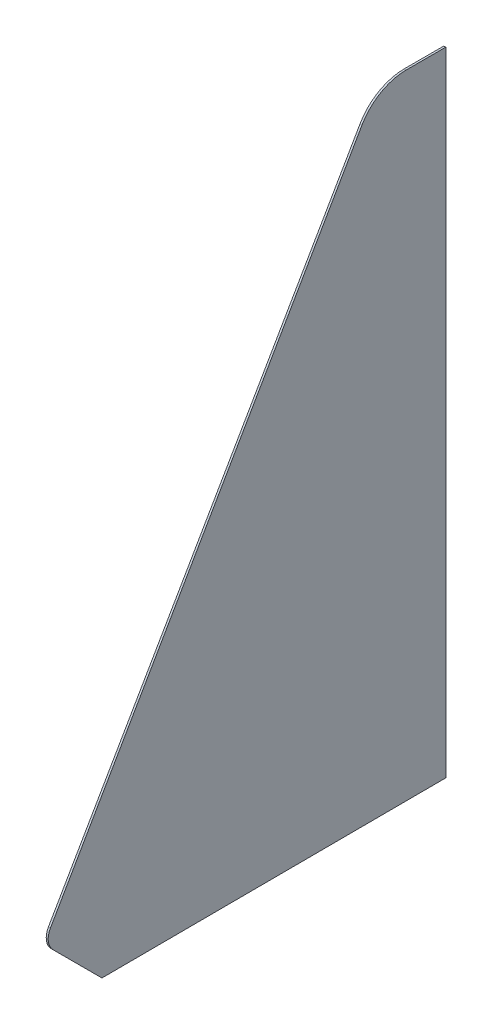
ISO-10303-21;
HEADER;
FILE_DESCRIPTION(('STEP AP214'),'2;1');
FILE_NAME('part.step','',(''),(''),'','','');
FILE_SCHEMA(('AUTOMOTIVE_DESIGN { 1 0 10303 214 1 1 1 1 }'));
ENDSEC;
DATA;
#1=APPLICATION_CONTEXT('core data for automotive mechanical design processes');
#2=APPLICATION_PROTOCOL_DEFINITION('international standard','automotive_design',2000,#1);
#3=PRODUCT_CONTEXT('',#1,'mechanical');
#4=PRODUCT('Part','Part','',(#3));
#5=PRODUCT_RELATED_PRODUCT_CATEGORY('part','',(#4));
#6=PRODUCT_DEFINITION_FORMATION('','',#4);
#7=PRODUCT_DEFINITION_CONTEXT('part definition',#1,'design');
#8=PRODUCT_DEFINITION('design','',#6,#7);
#9=PRODUCT_DEFINITION_SHAPE('','',#8);
#10=(LENGTH_UNIT() NAMED_UNIT(*) SI_UNIT(.MILLI.,.METRE.));
#11=(NAMED_UNIT(*) PLANE_ANGLE_UNIT() SI_UNIT($,.RADIAN.));
#12=(NAMED_UNIT(*) SI_UNIT($,.STERADIAN.) SOLID_ANGLE_UNIT());
#13=UNCERTAINTY_MEASURE_WITH_UNIT(LENGTH_MEASURE(1.E-05),#10,'distance_accuracy_value','');
#14=(GEOMETRIC_REPRESENTATION_CONTEXT(3) GLOBAL_UNCERTAINTY_ASSIGNED_CONTEXT((#13)) GLOBAL_UNIT_ASSIGNED_CONTEXT((#10,
#11,#12)) REPRESENTATION_CONTEXT('',''));
#15=CARTESIAN_POINT('',(0.,0.,0.));
#16=DIRECTION('',(0.,0.,1.));
#17=DIRECTION('',(1.,0.,0.));
#18=AXIS2_PLACEMENT_3D('',#15,#16,#17);
#19=CARTESIAN_POINT('',(0.,589.999999999999,39.9999999999981));
#20=DIRECTION('',(-1.,0.,0.));
#21=DIRECTION('',(0.,0.,1.));
#22=AXIS2_PLACEMENT_3D('',#19,#20,#21);
#23=CYLINDRICAL_SURFACE('',#22,52.0000000000009);
#24=DIRECTION('',(1.,0.,0.));
#25=VECTOR('',#24,1.);
#26=CARTESIAN_POINT('',(0.,641.999999999999,39.9999999999981));
#27=LINE('',#26,#25);
#28=CARTESIAN_POINT('',(0.,641.999999999999,39.9999999999981));
#29=VERTEX_POINT('',#28);
#30=CARTESIAN_POINT('',(2.,641.999999999999,39.9999999999981));
#31=VERTEX_POINT('',#30);
#32=EDGE_CURVE('E11',#29,#31,#27,.T.);
#33=ORIENTED_EDGE('',*,*,#32,.F.);
#34=CARTESIAN_POINT('',(0.,589.999999999999,39.9999999999981));
#35=DIRECTION('',(1.,0.,0.));
#36=DIRECTION('',(0.,0.,-1.));
#37=AXIS2_PLACEMENT_3D('',#34,#35,#36);
#38=CIRCLE('',#37,52.0000000000009);
#39=CARTESIAN_POINT('',(0.,615.999999999999,85.0333209967898));
#40=VERTEX_POINT('',#39);
#41=EDGE_CURVE('E152',#29,#40,#38,.T.);
#42=ORIENTED_EDGE('',*,*,#41,.T.);
#43=DIRECTION('',(1.,0.,0.));
#44=VECTOR('',#43,1.);
#45=CARTESIAN_POINT('',(0.,615.999999999999,85.0333209967898));
#46=LINE('',#45,#44);
#47=CARTESIAN_POINT('',(2.,615.999999999999,85.0333209967898));
#48=VERTEX_POINT('',#47);
#49=EDGE_CURVE('E60',#40,#48,#46,.T.);
#50=ORIENTED_EDGE('',*,*,#49,.T.);
#51=CARTESIAN_POINT('',(2.,589.999999999999,39.9999999999981));
#52=DIRECTION('',(1.,0.,0.));
#53=DIRECTION('',(0.,0.,-1.));
#54=AXIS2_PLACEMENT_3D('',#51,#52,#53);
#55=CIRCLE('',#54,52.0000000000009);
#56=EDGE_CURVE('E151',#31,#48,#55,.T.);
#57=ORIENTED_EDGE('',*,*,#56,.F.);
#58=EDGE_LOOP('',(#33,#42,#50,#57));
#59=FACE_BOUND('',#58,.T.);
#60=ADVANCED_FACE('F49',(#59),#23,.T.);
#61=CARTESIAN_POINT('',(0.,615.999999999999,85.0333209967898));
#62=DIRECTION('',(0.,-0.5,-0.866025403784439));
#63=DIRECTION('',(0.,-0.866025403784439,0.5));
#64=AXIS2_PLACEMENT_3D('',#61,#62,#63);
#65=PLANE('',#64);
#66=ORIENTED_EDGE('',*,*,#49,.F.);
#67=DIRECTION('',(0.,-0.866025403784439,0.5));
#68=VECTOR('',#67,1.);
#69=CARTESIAN_POINT('',(0.,615.999999999999,85.0333209967898));
#70=LINE('',#69,#68);
#71=CARTESIAN_POINT('',(0.,68.6719448082339,401.03332099679));
#72=VERTEX_POINT('',#71);
#73=EDGE_CURVE('E182',#40,#72,#70,.T.);
#74=ORIENTED_EDGE('',*,*,#73,.T.);
#75=DIRECTION('',(1.,0.,0.));
#76=VECTOR('',#75,1.);
#77=CARTESIAN_POINT('',(0.,68.6719448082339,401.03332099679));
#78=LINE('',#77,#76);
#79=CARTESIAN_POINT('',(2.,68.6719448082339,401.03332099679));
#80=VERTEX_POINT('',#79);
#81=EDGE_CURVE('E143',#72,#80,#78,.T.);
#82=ORIENTED_EDGE('',*,*,#81,.T.);
#83=DIRECTION('',(0.,-0.866025403784439,0.5));
#84=VECTOR('',#83,1.);
#85=CARTESIAN_POINT('',(2.,615.999999999999,85.0333209967898));
#86=LINE('',#85,#84);
#87=EDGE_CURVE('E162',#48,#80,#86,.T.);
#88=ORIENTED_EDGE('',*,*,#87,.F.);
#89=EDGE_LOOP('',(#66,#74,#82,#88));
#90=FACE_BOUND('',#89,.T.);
#91=ADVANCED_FACE('F167',(#90),#65,.F.);
#92=CARTESIAN_POINT('',(0.,60.1719448082339,386.310889132454));
#93=DIRECTION('',(-1.,0.,0.));
#94=DIRECTION('',(0.,0.,1.));
#95=AXIS2_PLACEMENT_3D('',#92,#93,#94);
#96=CYLINDRICAL_SURFACE('',#95,17.0000000000001);
#97=ORIENTED_EDGE('',*,*,#81,.F.);
#98=CARTESIAN_POINT('',(0.,60.1719448082339,386.310889132454));
#99=DIRECTION('',(1.,0.,0.));
#100=DIRECTION('',(0.,0.,1.));
#101=AXIS2_PLACEMENT_3D('',#98,#99,#100);
#102=CIRCLE('',#101,17.0000000000001);
#103=CARTESIAN_POINT('',(0.,48.1511295280625,398.331704412626));
#104=VERTEX_POINT('',#103);
#105=EDGE_CURVE('E134',#72,#104,#102,.T.);
#106=ORIENTED_EDGE('',*,*,#105,.T.);
#107=DIRECTION('',(1.,0.,0.));
#108=VECTOR('',#107,1.);
#109=CARTESIAN_POINT('',(0.,48.1511295280625,398.331704412626));
#110=LINE('',#109,#108);
#111=CARTESIAN_POINT('',(2.,48.1511295280625,398.331704412626));
#112=VERTEX_POINT('',#111);
#113=EDGE_CURVE('E140',#104,#112,#110,.T.);
#114=ORIENTED_EDGE('',*,*,#113,.T.);
#115=CARTESIAN_POINT('',(2.,60.1719448082339,386.310889132454));
#116=DIRECTION('',(1.,0.,0.));
#117=DIRECTION('',(0.,0.,-1.));
#118=AXIS2_PLACEMENT_3D('',#115,#116,#117);
#119=CIRCLE('',#118,17.0000000000001);
#120=EDGE_CURVE('E169',#80,#112,#119,.T.);
#121=ORIENTED_EDGE('',*,*,#120,.F.);
#122=EDGE_LOOP('',(#97,#106,#114,#121));
#123=FACE_BOUND('',#122,.T.);
#124=ADVANCED_FACE('F188',(#123),#96,.T.);
#125=CARTESIAN_POINT('',(0.,-1.41421356237309,348.76636132219));
#126=DIRECTION('',(0.,0.707106781186548,-0.707106781186547));
#127=DIRECTION('',(0.,-0.707106781186547,-0.707106781186548));
#128=AXIS2_PLACEMENT_3D('',#125,#126,#127);
#129=PLANE('',#128);
#130=ORIENTED_EDGE('',*,*,#113,.F.);
#131=DIRECTION('',(0.,-0.707106781186547,-0.707106781186548));
#132=VECTOR('',#131,1.);
#133=CARTESIAN_POINT('',(0.,-1.41421356237309,348.76636132219));
#134=LINE('',#133,#132);
#135=CARTESIAN_POINT('',(0.,-1.41421356237309,348.76636132219));
#136=VERTEX_POINT('',#135);
#137=EDGE_CURVE('E128',#104,#136,#134,.T.);
#138=ORIENTED_EDGE('',*,*,#137,.T.);
#139=DIRECTION('',(1.,0.,0.));
#140=VECTOR('',#139,1.);
#141=CARTESIAN_POINT('',(0.,-1.41421356237309,348.76636132219));
#142=LINE('',#141,#140);
#143=CARTESIAN_POINT('',(2.,-1.41421356237309,348.76636132219));
#144=VERTEX_POINT('',#143);
#145=EDGE_CURVE('E103',#136,#144,#142,.T.);
#146=ORIENTED_EDGE('',*,*,#145,.T.);
#147=DIRECTION('',(0.,-0.707106781186547,-0.707106781186548));
#148=VECTOR('',#147,1.);
#149=CARTESIAN_POINT('',(2.,-1.41421356237309,348.76636132219));
#150=LINE('',#149,#148);
#151=EDGE_CURVE('E172',#112,#144,#150,.T.);
#152=ORIENTED_EDGE('',*,*,#151,.F.);
#153=EDGE_LOOP('',(#130,#138,#146,#152));
#154=FACE_BOUND('',#153,.T.);
#155=ADVANCED_FACE('F190',(#154),#129,.F.);
#156=CARTESIAN_POINT('',(0.,0.,0.));
#157=DIRECTION('',(0.,0.999991778984563,0.00405486908410621));
#158=DIRECTION('',(0.,0.00405486908410621,-0.999991778984563));
#159=AXIS2_PLACEMENT_3D('',#156,#157,#158);
#160=PLANE('',#159);
#161=ORIENTED_EDGE('',*,*,#145,.F.);
#162=DIRECTION('',(0.,0.00405486908410621,-0.999991778984563));
#163=VECTOR('',#162,1.);
#164=CARTESIAN_POINT('',(0.,0.,0.));
#165=LINE('',#164,#163);
#166=CARTESIAN_POINT('',(0.,0.,0.));
#167=VERTEX_POINT('',#166);
#168=EDGE_CURVE('E120',#136,#167,#165,.T.);
#169=ORIENTED_EDGE('',*,*,#168,.T.);
#170=DIRECTION('',(1.,0.,0.));
#171=VECTOR('',#170,1.);
#172=CARTESIAN_POINT('',(0.,0.,0.));
#173=LINE('',#172,#171);
#174=CARTESIAN_POINT('',(2.,0.,0.));
#175=VERTEX_POINT('',#174);
#176=EDGE_CURVE('E68',#167,#175,#173,.T.);
#177=ORIENTED_EDGE('',*,*,#176,.T.);
#178=DIRECTION('',(0.,0.00405486908410621,-0.999991778984563));
#179=VECTOR('',#178,1.);
#180=CARTESIAN_POINT('',(2.,0.,0.));
#181=LINE('',#180,#179);
#182=EDGE_CURVE('E194',#144,#175,#181,.T.);
#183=ORIENTED_EDGE('',*,*,#182,.F.);
#184=EDGE_LOOP('',(#161,#169,#177,#183));
#185=FACE_BOUND('',#184,.T.);
#186=ADVANCED_FACE('F126',(#185),#160,.F.);
#187=CARTESIAN_POINT('',(0.,641.999999999999,0.));
#188=DIRECTION('',(0.,0.,1.));
#189=DIRECTION('',(0.,1.,0.));
#190=AXIS2_PLACEMENT_3D('',#187,#188,#189);
#191=PLANE('',#190);
#192=ORIENTED_EDGE('',*,*,#176,.F.);
#193=DIRECTION('',(0.,1.,0.));
#194=VECTOR('',#193,1.);
#195=CARTESIAN_POINT('',(0.,641.999999999999,0.));
#196=LINE('',#195,#194);
#197=CARTESIAN_POINT('',(0.,641.999999999999,0.));
#198=VERTEX_POINT('',#197);
#199=EDGE_CURVE('E109',#167,#198,#196,.T.);
#200=ORIENTED_EDGE('',*,*,#199,.T.);
#201=DIRECTION('',(1.,0.,0.));
#202=VECTOR('',#201,1.);
#203=CARTESIAN_POINT('',(0.,641.999999999999,0.));
#204=LINE('',#203,#202);
#205=CARTESIAN_POINT('',(2.,641.999999999999,0.));
#206=VERTEX_POINT('',#205);
#207=EDGE_CURVE('E53',#198,#206,#204,.T.);
#208=ORIENTED_EDGE('',*,*,#207,.T.);
#209=DIRECTION('',(0.,1.,0.));
#210=VECTOR('',#209,1.);
#211=CARTESIAN_POINT('',(2.,60.1719448082339,0.));
#212=LINE('',#211,#210);
#213=EDGE_CURVE('E111',#175,#206,#212,.T.);
#214=ORIENTED_EDGE('',*,*,#213,.F.);
#215=EDGE_LOOP('',(#192,#200,#208,#214));
#216=FACE_BOUND('',#215,.T.);
#217=ADVANCED_FACE('F108',(#216),#191,.F.);
#218=CARTESIAN_POINT('',(0.,641.999999999999,0.));
#219=DIRECTION('',(0.,-1.,0.));
#220=DIRECTION('',(0.,0.,1.));
#221=AXIS2_PLACEMENT_3D('',#218,#219,#220);
#222=PLANE('',#221);
#223=DIRECTION('',(0.,0.,1.));
#224=VECTOR('',#223,1.);
#225=CARTESIAN_POINT('',(0.,641.999999999999,0.));
#226=LINE('',#225,#224);
#227=EDGE_CURVE('E123',#198,#29,#226,.T.);
#228=ORIENTED_EDGE('',*,*,#227,.T.);
#229=ORIENTED_EDGE('',*,*,#32,.T.);
#230=DIRECTION('',(0.,0.,1.));
#231=VECTOR('',#230,1.);
#232=CARTESIAN_POINT('',(2.,641.999999999999,386.310889132454));
#233=LINE('',#232,#231);
#234=EDGE_CURVE('E132',#206,#31,#233,.T.);
#235=ORIENTED_EDGE('',*,*,#234,.F.);
#236=ORIENTED_EDGE('',*,*,#207,.F.);
#237=EDGE_LOOP('',(#228,#229,#235,#236));
#238=FACE_BOUND('',#237,.T.);
#239=ADVANCED_FACE('F51',(#238),#222,.F.);
#240=CARTESIAN_POINT('',(2.,60.1719448082339,386.310889132454));
#241=DIRECTION('',(-1.,0.,0.));
#242=DIRECTION('',(0.,0.,1.));
#243=AXIS2_PLACEMENT_3D('',#240,#241,#242);
#244=PLANE('',#243);
#245=ORIENTED_EDGE('',*,*,#213,.T.);
#246=ORIENTED_EDGE('',*,*,#234,.T.);
#247=ORIENTED_EDGE('',*,*,#56,.T.);
#248=ORIENTED_EDGE('',*,*,#87,.T.);
#249=ORIENTED_EDGE('',*,*,#120,.T.);
#250=ORIENTED_EDGE('',*,*,#151,.T.);
#251=ORIENTED_EDGE('',*,*,#182,.T.);
#252=EDGE_LOOP('',(#245,#246,#247,#248,#249,#250,#251));
#253=FACE_BOUND('',#252,.T.);
#254=ADVANCED_FACE('F160',(#253),#244,.F.);
#255=CARTESIAN_POINT('',(0.,60.1719448082339,386.310889132454));
#256=DIRECTION('',(-1.,0.,0.));
#257=DIRECTION('',(0.,0.,1.));
#258=AXIS2_PLACEMENT_3D('',#255,#256,#257);
#259=PLANE('',#258);
#260=ORIENTED_EDGE('',*,*,#199,.F.);
#261=ORIENTED_EDGE('',*,*,#168,.F.);
#262=ORIENTED_EDGE('',*,*,#137,.F.);
#263=ORIENTED_EDGE('',*,*,#105,.F.);
#264=ORIENTED_EDGE('',*,*,#73,.F.);
#265=ORIENTED_EDGE('',*,*,#41,.F.);
#266=ORIENTED_EDGE('',*,*,#227,.F.);
#267=EDGE_LOOP('',(#260,#261,#262,#263,#264,#265,#266));
#268=FACE_BOUND('',#267,.T.);
#269=ADVANCED_FACE('F118',(#268),#259,.T.);
#270=CLOSED_SHELL('',(#60,#91,#124,#155,#186,#217,#239,#254,#269));
#271=MANIFOLD_SOLID_BREP('B2',#270);
#272=ADVANCED_BREP_SHAPE_REPRESENTATION('',(#18,#271),#14);
#273=SHAPE_DEFINITION_REPRESENTATION(#9,#272);
ENDSEC;
END-ISO-10303-21;
